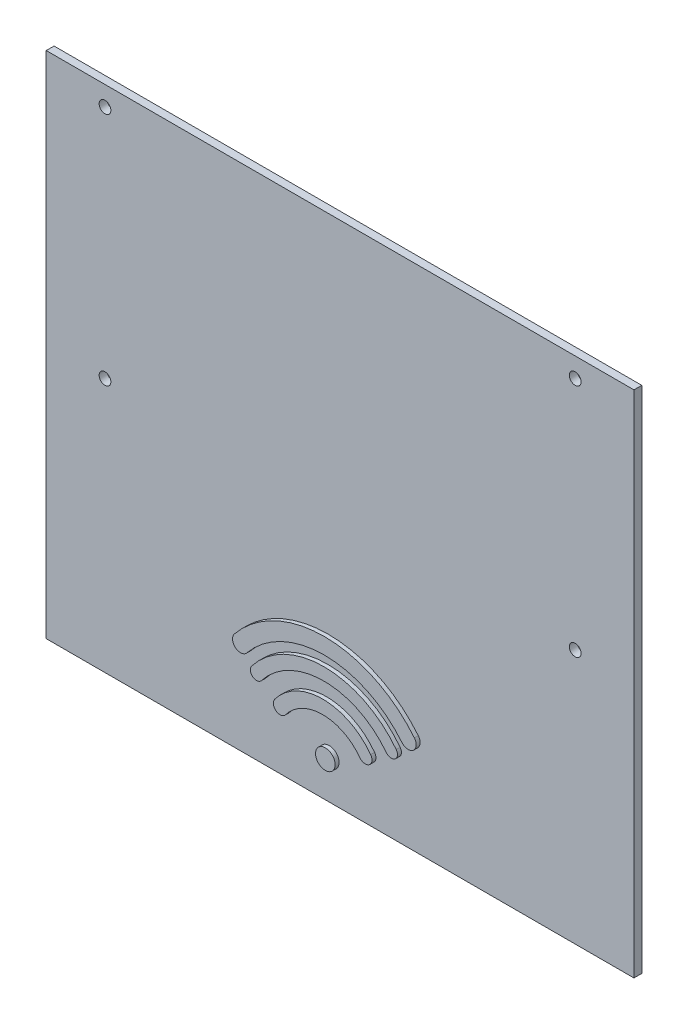
ISO-10303-21;
HEADER;
FILE_DESCRIPTION(('STEP AP214'),'2;1');
FILE_NAME('part.step','',(''),(''),'','','');
FILE_SCHEMA(('AUTOMOTIVE_DESIGN { 1 0 10303 214 1 1 1 1 }'));
ENDSEC;
DATA;
#1=APPLICATION_CONTEXT('core data for automotive mechanical design processes');
#2=APPLICATION_PROTOCOL_DEFINITION('international standard','automotive_design',2000,#1);
#3=PRODUCT_CONTEXT('',#1,'mechanical');
#4=PRODUCT('Part','Part','',(#3));
#5=PRODUCT_RELATED_PRODUCT_CATEGORY('part','',(#4));
#6=PRODUCT_DEFINITION_FORMATION('','',#4);
#7=PRODUCT_DEFINITION_CONTEXT('part definition',#1,'design');
#8=PRODUCT_DEFINITION('design','',#6,#7);
#9=PRODUCT_DEFINITION_SHAPE('','',#8);
#10=(LENGTH_UNIT() NAMED_UNIT(*) SI_UNIT(.MILLI.,.METRE.));
#11=(NAMED_UNIT(*) PLANE_ANGLE_UNIT() SI_UNIT($,.RADIAN.));
#12=(NAMED_UNIT(*) SI_UNIT($,.STERADIAN.) SOLID_ANGLE_UNIT());
#13=UNCERTAINTY_MEASURE_WITH_UNIT(LENGTH_MEASURE(1.E-05),#10,'distance_accuracy_value','');
#14=(GEOMETRIC_REPRESENTATION_CONTEXT(3) GLOBAL_UNCERTAINTY_ASSIGNED_CONTEXT((#13)) GLOBAL_UNIT_ASSIGNED_CONTEXT((#10,
#11,#12)) REPRESENTATION_CONTEXT('',''));
#15=CARTESIAN_POINT('',(0.,0.,0.));
#16=DIRECTION('',(0.,0.,1.));
#17=DIRECTION('',(1.,0.,0.));
#18=AXIS2_PLACEMENT_3D('',#15,#16,#17);
#19=CARTESIAN_POINT('',(0.,0.,2.));
#20=DIRECTION('',(0.,0.,1.));
#21=DIRECTION('',(1.,0.,0.));
#22=AXIS2_PLACEMENT_3D('',#19,#20,#21);
#23=PLANE('',#22);
#24=CARTESIAN_POINT('',(-4.64809572967323,-79.0103397341211,2.));
#25=DIRECTION('',(0.,0.,1.));
#26=DIRECTION('',(1.,0.,0.));
#27=AXIS2_PLACEMENT_3D('',#24,#25,#26);
#28=CIRCLE('',#27,2.5);
#29=CARTESIAN_POINT('',(-2.14809572967323,-79.0103397341211,2.));
#30=VERTEX_POINT('',#29);
#31=EDGE_CURVE('E233',#30,#30,#28,.T.);
#32=ORIENTED_EDGE('',*,*,#31,.F.);
#33=EDGE_LOOP('',(#32));
#34=FACE_BOUND('',#33,.T.);
#35=CARTESIAN_POINT('',(-61.8867474150665,-24.0103397341211,2.));
#36=DIRECTION('',(0.,0.,1.));
#37=DIRECTION('',(1.,0.,0.));
#38=AXIS2_PLACEMENT_3D('',#35,#36,#37);
#39=CIRCLE('',#38,1.5);
#40=CARTESIAN_POINT('',(-60.3867474150665,-24.0103397341211,2.));
#41=VERTEX_POINT('',#40);
#42=EDGE_CURVE('E246',#41,#41,#39,.T.);
#43=ORIENTED_EDGE('',*,*,#42,.F.);
#44=EDGE_LOOP('',(#43));
#45=FACE_BOUND('',#44,.T.);
#46=CARTESIAN_POINT('',(-61.8867474150665,35.9896602658789,2.));
#47=DIRECTION('',(0.,0.,1.));
#48=DIRECTION('',(1.,0.,0.));
#49=AXIS2_PLACEMENT_3D('',#46,#47,#48);
#50=CIRCLE('',#49,1.5);
#51=CARTESIAN_POINT('',(-60.3867474150665,35.9896602658789,2.));
#52=VERTEX_POINT('',#51);
#53=EDGE_CURVE('E258',#52,#52,#50,.T.);
#54=ORIENTED_EDGE('',*,*,#53,.F.);
#55=EDGE_LOOP('',(#54));
#56=FACE_BOUND('',#55,.T.);
#57=DIRECTION('',(0.,-1.,0.));
#58=VECTOR('',#57,1.);
#59=CARTESIAN_POINT('',(-76.8867474150665,40.9896602658789,2.));
#60=LINE('',#59,#58);
#61=CARTESIAN_POINT('',(-76.8867474150665,40.9896602658789,2.));
#62=VERTEX_POINT('',#61);
#63=CARTESIAN_POINT('',(-76.8867474150665,-89.0103397341211,2.));
#64=VERTEX_POINT('',#63);
#65=EDGE_CURVE('E264',#62,#64,#60,.T.);
#66=ORIENTED_EDGE('',*,*,#65,.T.);
#67=DIRECTION('',(1.,0.,0.));
#68=VECTOR('',#67,1.);
#69=CARTESIAN_POINT('',(-76.8867474150665,-89.0103397341211,2.));
#70=LINE('',#69,#68);
#71=CARTESIAN_POINT('',(73.1132525849335,-89.0103397341211,2.));
#72=VERTEX_POINT('',#71);
#73=EDGE_CURVE('E267',#64,#72,#70,.T.);
#74=ORIENTED_EDGE('',*,*,#73,.T.);
#75=DIRECTION('',(0.,1.,0.));
#76=VECTOR('',#75,1.);
#77=CARTESIAN_POINT('',(73.1132525849335,40.9896602658789,2.));
#78=LINE('',#77,#76);
#79=CARTESIAN_POINT('',(73.1132525849335,40.9896602658789,2.));
#80=VERTEX_POINT('',#79);
#81=EDGE_CURVE('E270',#72,#80,#78,.T.);
#82=ORIENTED_EDGE('',*,*,#81,.T.);
#83=DIRECTION('',(-1.,0.,0.));
#84=VECTOR('',#83,1.);
#85=CARTESIAN_POINT('',(-76.8867474150665,40.9896602658789,2.));
#86=LINE('',#85,#84);
#87=EDGE_CURVE('E272',#80,#62,#86,.T.);
#88=ORIENTED_EDGE('',*,*,#87,.T.);
#89=EDGE_LOOP('',(#66,#74,#82,#88));
#90=FACE_BOUND('',#89,.T.);
#91=CARTESIAN_POINT('',(58.1132525849335,35.9896602658789,2.));
#92=DIRECTION('',(0.,0.,1.));
#93=DIRECTION('',(1.,0.,0.));
#94=AXIS2_PLACEMENT_3D('',#91,#92,#93);
#95=CIRCLE('',#94,1.5);
#96=CARTESIAN_POINT('',(59.6132525849335,35.9896602658789,2.));
#97=VERTEX_POINT('',#96);
#98=EDGE_CURVE('E252',#97,#97,#95,.T.);
#99=ORIENTED_EDGE('',*,*,#98,.F.);
#100=EDGE_LOOP('',(#99));
#101=FACE_BOUND('',#100,.T.);
#102=CARTESIAN_POINT('',(58.1132525849335,-24.0103397341211,2.));
#103=DIRECTION('',(0.,0.,1.));
#104=DIRECTION('',(1.,0.,0.));
#105=AXIS2_PLACEMENT_3D('',#102,#103,#104);
#106=CIRCLE('',#105,1.5);
#107=CARTESIAN_POINT('',(59.6132525849335,-24.0103397341211,2.));
#108=VERTEX_POINT('',#107);
#109=EDGE_CURVE('E240',#108,#108,#106,.T.);
#110=ORIENTED_EDGE('',*,*,#109,.F.);
#111=EDGE_LOOP('',(#110));
#112=FACE_BOUND('',#111,.T.);
#113=CARTESIAN_POINT('',(-5.32355895711767,-81.302705542707,2.));
#114=DIRECTION('',(0.,0.,1.));
#115=DIRECTION('',(1.,0.,0.));
#116=AXIS2_PLACEMENT_3D('',#113,#114,#115);
#117=CIRCLE('',#116,15.2395534537991);
#118=CARTESIAN_POINT('',(6.92323534215543,-72.2329746281489,2.));
#119=VERTEX_POINT('',#118);
#120=CARTESIAN_POINT('',(-17.5703532563908,-72.2329746281489,2.));
#121=VERTEX_POINT('',#120);
#122=EDGE_CURVE('E218',#119,#121,#117,.T.);
#123=ORIENTED_EDGE('',*,*,#122,.F.);
#124=CARTESIAN_POINT('',(5.54142549136216,-73.2563153665922,2.));
#125=DIRECTION('',(0.,0.,1.));
#126=DIRECTION('',(1.,0.,0.));
#127=AXIS2_PLACEMENT_3D('',#124,#125,#126);
#128=CIRCLE('',#127,1.71948385590179);
#129=CARTESIAN_POINT('',(4.1596156405689,-74.2796561050354,2.));
#130=VERTEX_POINT('',#129);
#131=EDGE_CURVE('E204',#130,#119,#128,.T.);
#132=ORIENTED_EDGE('',*,*,#131,.F.);
#133=CARTESIAN_POINT('',(-5.32355895711767,-81.302705542707,2.));
#134=DIRECTION('',(0.,0.,-1.));
#135=DIRECTION('',(1.,0.,0.));
#136=AXIS2_PLACEMENT_3D('',#133,#134,#135);
#137=CIRCLE('',#136,11.8005857419955);
#138=CARTESIAN_POINT('',(-14.8067335548042,-74.2796561050354,2.));
#139=VERTEX_POINT('',#138);
#140=EDGE_CURVE('E209',#139,#130,#137,.T.);
#141=ORIENTED_EDGE('',*,*,#140,.F.);
#142=CARTESIAN_POINT('',(-16.1885434055975,-73.2563153665922,2.));
#143=DIRECTION('',(0.,0.,1.));
#144=DIRECTION('',(1.,0.,0.));
#145=AXIS2_PLACEMENT_3D('',#142,#143,#144);
#146=CIRCLE('',#145,1.71948385590179);
#147=EDGE_CURVE('E220',#121,#139,#146,.T.);
#148=ORIENTED_EDGE('',*,*,#147,.F.);
#149=EDGE_LOOP('',(#123,#132,#141,#148));
#150=FACE_BOUND('',#149,.T.);
#151=CARTESIAN_POINT('',(-4.90031856724826,-81.6455579537006,2.));
#152=DIRECTION('',(0.,0.,1.));
#153=DIRECTION('',(1.,0.,0.));
#154=AXIS2_PLACEMENT_3D('',#151,#152,#153);
#155=CIRCLE('',#154,29.6115661554169);
#156=CARTESIAN_POINT('',(18.0783973424086,-62.9687417014611,2.));
#157=VERTEX_POINT('',#156);
#158=CARTESIAN_POINT('',(-27.8790344769051,-62.9687417014611,2.));
#159=VERTEX_POINT('',#158);
#160=EDGE_CURVE('E176',#157,#159,#155,.T.);
#161=ORIENTED_EDGE('',*,*,#160,.F.);
#162=CARTESIAN_POINT('',(16.4865053202874,-64.2626118597178,2.));
#163=DIRECTION('',(0.,0.,1.));
#164=DIRECTION('',(1.,0.,0.));
#165=AXIS2_PLACEMENT_3D('',#162,#163,#164);
#166=CIRCLE('',#165,2.05139469544994);
#167=CARTESIAN_POINT('',(14.8946132981662,-65.5564820179745,2.));
#168=VERTEX_POINT('',#167);
#169=EDGE_CURVE('E173',#168,#157,#166,.T.);
#170=ORIENTED_EDGE('',*,*,#169,.F.);
#171=CARTESIAN_POINT('',(-4.90031856724826,-81.6455579537006,2.));
#172=DIRECTION('',(0.,0.,-1.));
#173=DIRECTION('',(1.,0.,0.));
#174=AXIS2_PLACEMENT_3D('',#171,#172,#173);
#175=CIRCLE('',#174,25.508776764517);
#176=CARTESIAN_POINT('',(-24.6952504326628,-65.5564820179745,2.));
#177=VERTEX_POINT('',#176);
#178=EDGE_CURVE('E185',#177,#168,#175,.T.);
#179=ORIENTED_EDGE('',*,*,#178,.F.);
#180=CARTESIAN_POINT('',(-26.2871424547839,-64.2626118597178,2.));
#181=DIRECTION('',(0.,0.,1.));
#182=DIRECTION('',(1.,0.,0.));
#183=AXIS2_PLACEMENT_3D('',#180,#181,#182);
#184=CIRCLE('',#183,2.05139469544994);
#185=EDGE_CURVE('E193',#159,#177,#184,.T.);
#186=ORIENTED_EDGE('',*,*,#185,.F.);
#187=EDGE_LOOP('',(#161,#170,#179,#186));
#188=FACE_BOUND('',#187,.T.);
#189=CARTESIAN_POINT('',(-5.00790134380225,-82.0049986601813,2.));
#190=DIRECTION('',(0.,0.,1.));
#191=DIRECTION('',(1.,0.,0.));
#192=AXIS2_PLACEMENT_3D('',#189,#190,#191);
#193=CIRCLE('',#192,23.2550698957289);
#194=CARTESIAN_POINT('',(13.4430372930683,-67.8501005936576,2.));
#195=VERTEX_POINT('',#194);
#196=CARTESIAN_POINT('',(-23.4588399806728,-67.8501005936576,2.));
#197=VERTEX_POINT('',#196);
#198=EDGE_CURVE('E577',#195,#197,#193,.T.);
#199=ORIENTED_EDGE('',*,*,#198,.F.);
#200=CARTESIAN_POINT('',(12.1808720630696,-68.8183884691611,2.));
#201=DIRECTION('',(0.,0.,1.));
#202=DIRECTION('',(1.,0.,0.));
#203=AXIS2_PLACEMENT_3D('',#200,#201,#202);
#204=CIRCLE('',#203,1.59079932036215);
#205=CARTESIAN_POINT('',(10.918706833071,-69.7866763446646,2.));
#206=VERTEX_POINT('',#205);
#207=EDGE_CURVE('E171',#206,#195,#204,.T.);
#208=ORIENTED_EDGE('',*,*,#207,.F.);
#209=CARTESIAN_POINT('',(-5.00790134380225,-82.0049986601813,2.));
#210=DIRECTION('',(0.,0.,-1.));
#211=DIRECTION('',(1.,0.,0.));
#212=AXIS2_PLACEMENT_3D('',#209,#210,#211);
#213=CIRCLE('',#212,20.0734712550046);
#214=CARTESIAN_POINT('',(-20.9345095206755,-69.7866763446646,2.));
#215=VERTEX_POINT('',#214);
#216=EDGE_CURVE('E167',#215,#206,#213,.T.);
#217=ORIENTED_EDGE('',*,*,#216,.F.);
#218=CARTESIAN_POINT('',(-22.1966747506741,-68.8183884691611,2.));
#219=DIRECTION('',(0.,0.,1.));
#220=DIRECTION('',(1.,0.,0.));
#221=AXIS2_PLACEMENT_3D('',#218,#219,#220);
#222=CIRCLE('',#221,1.59079932036215);
#223=EDGE_CURVE('E574',#197,#215,#222,.T.);
#224=ORIENTED_EDGE('',*,*,#223,.F.);
#225=EDGE_LOOP('',(#199,#208,#217,#224));
#226=FACE_BOUND('',#225,.T.);
#227=ADVANCED_FACE('F34',(#34,#45,#56,#90,#101,#112,#150,#188,#226),#23,.T.);
#228=CARTESIAN_POINT('',(0.,0.,0.));
#229=DIRECTION('',(0.,0.,1.));
#230=DIRECTION('',(1.,0.,0.));
#231=AXIS2_PLACEMENT_3D('',#228,#229,#230);
#232=PLANE('',#231);
#233=DIRECTION('',(0.,-1.,0.));
#234=VECTOR('',#233,1.);
#235=CARTESIAN_POINT('',(-76.8867474150665,40.9896602658789,0.));
#236=LINE('',#235,#234);
#237=CARTESIAN_POINT('',(-76.8867474150665,40.9896602658789,0.));
#238=VERTEX_POINT('',#237);
#239=CARTESIAN_POINT('',(-76.8867474150665,-89.0103397341211,0.));
#240=VERTEX_POINT('',#239);
#241=EDGE_CURVE('E261',#238,#240,#236,.T.);
#242=ORIENTED_EDGE('',*,*,#241,.F.);
#243=DIRECTION('',(-1.,0.,0.));
#244=VECTOR('',#243,1.);
#245=CARTESIAN_POINT('',(-76.8867474150665,40.9896602658789,0.));
#246=LINE('',#245,#244);
#247=CARTESIAN_POINT('',(73.1132525849335,40.9896602658789,0.));
#248=VERTEX_POINT('',#247);
#249=EDGE_CURVE('E268',#248,#238,#246,.T.);
#250=ORIENTED_EDGE('',*,*,#249,.F.);
#251=DIRECTION('',(0.,1.,0.));
#252=VECTOR('',#251,1.);
#253=CARTESIAN_POINT('',(73.1132525849335,40.9896602658789,0.));
#254=LINE('',#253,#252);
#255=CARTESIAN_POINT('',(73.1132525849335,-89.0103397341211,0.));
#256=VERTEX_POINT('',#255);
#257=EDGE_CURVE('E279',#256,#248,#254,.T.);
#258=ORIENTED_EDGE('',*,*,#257,.F.);
#259=DIRECTION('',(1.,0.,0.));
#260=VECTOR('',#259,1.);
#261=CARTESIAN_POINT('',(-76.8867474150665,-89.0103397341211,0.));
#262=LINE('',#261,#260);
#263=EDGE_CURVE('E277',#240,#256,#262,.T.);
#264=ORIENTED_EDGE('',*,*,#263,.F.);
#265=EDGE_LOOP('',(#242,#250,#258,#264));
#266=FACE_BOUND('',#265,.T.);
#267=CARTESIAN_POINT('',(-61.8867474150665,35.9896602658789,0.));
#268=DIRECTION('',(0.,0.,1.));
#269=DIRECTION('',(1.,0.,0.));
#270=AXIS2_PLACEMENT_3D('',#267,#268,#269);
#271=CIRCLE('',#270,1.5);
#272=CARTESIAN_POINT('',(-60.3867474150665,35.9896602658789,0.));
#273=VERTEX_POINT('',#272);
#274=EDGE_CURVE('E255',#273,#273,#271,.T.);
#275=ORIENTED_EDGE('',*,*,#274,.T.);
#276=EDGE_LOOP('',(#275));
#277=FACE_BOUND('',#276,.T.);
#278=CARTESIAN_POINT('',(58.1132525849335,35.9896602658789,0.));
#279=DIRECTION('',(0.,0.,1.));
#280=DIRECTION('',(1.,0.,0.));
#281=AXIS2_PLACEMENT_3D('',#278,#279,#280);
#282=CIRCLE('',#281,1.5);
#283=CARTESIAN_POINT('',(59.6132525849335,35.9896602658789,0.));
#284=VERTEX_POINT('',#283);
#285=EDGE_CURVE('E249',#284,#284,#282,.T.);
#286=ORIENTED_EDGE('',*,*,#285,.T.);
#287=EDGE_LOOP('',(#286));
#288=FACE_BOUND('',#287,.T.);
#289=CARTESIAN_POINT('',(-61.8867474150665,-24.0103397341211,0.));
#290=DIRECTION('',(0.,0.,1.));
#291=DIRECTION('',(1.,0.,0.));
#292=AXIS2_PLACEMENT_3D('',#289,#290,#291);
#293=CIRCLE('',#292,1.5);
#294=CARTESIAN_POINT('',(-60.3867474150665,-24.0103397341211,0.));
#295=VERTEX_POINT('',#294);
#296=EDGE_CURVE('E243',#295,#295,#293,.T.);
#297=ORIENTED_EDGE('',*,*,#296,.T.);
#298=EDGE_LOOP('',(#297));
#299=FACE_BOUND('',#298,.T.);
#300=CARTESIAN_POINT('',(58.1132525849335,-24.0103397341211,0.));
#301=DIRECTION('',(0.,0.,1.));
#302=DIRECTION('',(1.,0.,0.));
#303=AXIS2_PLACEMENT_3D('',#300,#301,#302);
#304=CIRCLE('',#303,1.5);
#305=CARTESIAN_POINT('',(59.6132525849335,-24.0103397341211,0.));
#306=VERTEX_POINT('',#305);
#307=EDGE_CURVE('E237',#306,#306,#304,.T.);
#308=ORIENTED_EDGE('',*,*,#307,.T.);
#309=EDGE_LOOP('',(#308));
#310=FACE_BOUND('',#309,.T.);
#311=ADVANCED_FACE('F297',(#266,#277,#288,#299,#310),#232,.F.);
#312=CARTESIAN_POINT('',(-76.8867474150665,40.9896602658789,2.));
#313=DIRECTION('',(1.,0.,0.));
#314=DIRECTION('',(0.,1.,0.));
#315=AXIS2_PLACEMENT_3D('',#312,#313,#314);
#316=PLANE('',#315);
#317=ORIENTED_EDGE('',*,*,#241,.T.);
#318=DIRECTION('',(0.,0.,-1.));
#319=VECTOR('',#318,1.);
#320=CARTESIAN_POINT('',(-76.8867474150665,-89.0103397341211,2.));
#321=LINE('',#320,#319);
#322=EDGE_CURVE('E11',#64,#240,#321,.T.);
#323=ORIENTED_EDGE('',*,*,#322,.F.);
#324=ORIENTED_EDGE('',*,*,#65,.F.);
#325=DIRECTION('',(0.,0.,-1.));
#326=VECTOR('',#325,1.);
#327=CARTESIAN_POINT('',(-76.8867474150665,40.9896602658789,2.));
#328=LINE('',#327,#326);
#329=EDGE_CURVE('E274',#62,#238,#328,.T.);
#330=ORIENTED_EDGE('',*,*,#329,.T.);
#331=EDGE_LOOP('',(#317,#323,#324,#330));
#332=FACE_BOUND('',#331,.T.);
#333=ADVANCED_FACE('F36',(#332),#316,.F.);
#334=CARTESIAN_POINT('',(-76.8867474150665,-89.0103397341211,2.));
#335=DIRECTION('',(0.,1.,0.));
#336=DIRECTION('',(0.,0.,1.));
#337=AXIS2_PLACEMENT_3D('',#334,#335,#336);
#338=PLANE('',#337);
#339=ORIENTED_EDGE('',*,*,#263,.T.);
#340=DIRECTION('',(0.,0.,-1.));
#341=VECTOR('',#340,1.);
#342=CARTESIAN_POINT('',(73.1132525849335,-89.0103397341211,2.));
#343=LINE('',#342,#341);
#344=EDGE_CURVE('E42',#72,#256,#343,.T.);
#345=ORIENTED_EDGE('',*,*,#344,.F.);
#346=ORIENTED_EDGE('',*,*,#73,.F.);
#347=ORIENTED_EDGE('',*,*,#322,.T.);
#348=EDGE_LOOP('',(#339,#345,#346,#347));
#349=FACE_BOUND('',#348,.T.);
#350=ADVANCED_FACE('F308',(#349),#338,.F.);
#351=CARTESIAN_POINT('',(73.1132525849335,40.9896602658789,2.));
#352=DIRECTION('',(-1.,0.,0.));
#353=DIRECTION('',(0.,-1.,0.));
#354=AXIS2_PLACEMENT_3D('',#351,#352,#353);
#355=PLANE('',#354);
#356=ORIENTED_EDGE('',*,*,#257,.T.);
#357=DIRECTION('',(0.,0.,-1.));
#358=VECTOR('',#357,1.);
#359=CARTESIAN_POINT('',(73.1132525849335,40.9896602658789,2.));
#360=LINE('',#359,#358);
#361=EDGE_CURVE('E284',#80,#248,#360,.T.);
#362=ORIENTED_EDGE('',*,*,#361,.F.);
#363=ORIENTED_EDGE('',*,*,#81,.F.);
#364=ORIENTED_EDGE('',*,*,#344,.T.);
#365=EDGE_LOOP('',(#356,#362,#363,#364));
#366=FACE_BOUND('',#365,.T.);
#367=ADVANCED_FACE('F291',(#366),#355,.F.);
#368=CARTESIAN_POINT('',(-76.8867474150665,40.9896602658789,2.));
#369=DIRECTION('',(0.,-1.,0.));
#370=DIRECTION('',(1.,0.,0.));
#371=AXIS2_PLACEMENT_3D('',#368,#369,#370);
#372=PLANE('',#371);
#373=ORIENTED_EDGE('',*,*,#249,.T.);
#374=ORIENTED_EDGE('',*,*,#329,.F.);
#375=ORIENTED_EDGE('',*,*,#87,.F.);
#376=ORIENTED_EDGE('',*,*,#361,.T.);
#377=EDGE_LOOP('',(#373,#374,#375,#376));
#378=FACE_BOUND('',#377,.T.);
#379=ADVANCED_FACE('F301',(#378),#372,.F.);
#380=CARTESIAN_POINT('',(-61.8867474150665,35.9896602658789,2.));
#381=DIRECTION('',(0.,0.,-1.));
#382=DIRECTION('',(-1.,0.,0.));
#383=AXIS2_PLACEMENT_3D('',#380,#381,#382);
#384=CYLINDRICAL_SURFACE('',#383,1.5);
#385=ORIENTED_EDGE('',*,*,#53,.T.);
#386=EDGE_LOOP('',(#385));
#387=FACE_BOUND('',#386,.T.);
#388=ORIENTED_EDGE('',*,*,#274,.F.);
#389=EDGE_LOOP('',(#388));
#390=FACE_BOUND('',#389,.T.);
#391=ADVANCED_FACE('F325',(#387,#390),#384,.F.);
#392=CARTESIAN_POINT('',(58.1132525849335,35.9896602658789,2.));
#393=DIRECTION('',(0.,0.,-1.));
#394=DIRECTION('',(-1.,0.,0.));
#395=AXIS2_PLACEMENT_3D('',#392,#393,#394);
#396=CYLINDRICAL_SURFACE('',#395,1.5);
#397=ORIENTED_EDGE('',*,*,#98,.T.);
#398=EDGE_LOOP('',(#397));
#399=FACE_BOUND('',#398,.T.);
#400=ORIENTED_EDGE('',*,*,#285,.F.);
#401=EDGE_LOOP('',(#400));
#402=FACE_BOUND('',#401,.T.);
#403=ADVANCED_FACE('F332',(#399,#402),#396,.F.);
#404=CARTESIAN_POINT('',(-61.8867474150665,-24.0103397341211,2.));
#405=DIRECTION('',(0.,0.,-1.));
#406=DIRECTION('',(-1.,0.,0.));
#407=AXIS2_PLACEMENT_3D('',#404,#405,#406);
#408=CYLINDRICAL_SURFACE('',#407,1.5);
#409=ORIENTED_EDGE('',*,*,#42,.T.);
#410=EDGE_LOOP('',(#409));
#411=FACE_BOUND('',#410,.T.);
#412=ORIENTED_EDGE('',*,*,#296,.F.);
#413=EDGE_LOOP('',(#412));
#414=FACE_BOUND('',#413,.T.);
#415=ADVANCED_FACE('F337',(#411,#414),#408,.F.);
#416=CARTESIAN_POINT('',(58.1132525849335,-24.0103397341211,2.));
#417=DIRECTION('',(0.,0.,-1.));
#418=DIRECTION('',(-1.,0.,0.));
#419=AXIS2_PLACEMENT_3D('',#416,#417,#418);
#420=CYLINDRICAL_SURFACE('',#419,1.5);
#421=ORIENTED_EDGE('',*,*,#109,.T.);
#422=EDGE_LOOP('',(#421));
#423=FACE_BOUND('',#422,.T.);
#424=ORIENTED_EDGE('',*,*,#307,.F.);
#425=EDGE_LOOP('',(#424));
#426=FACE_BOUND('',#425,.T.);
#427=ADVANCED_FACE('F349',(#423,#426),#420,.F.);
#428=CARTESIAN_POINT('',(-4.64809572967323,-79.0103397341211,3.));
#429=DIRECTION('',(0.,0.,-1.));
#430=DIRECTION('',(-1.,0.,0.));
#431=AXIS2_PLACEMENT_3D('',#428,#429,#430);
#432=CYLINDRICAL_SURFACE('',#431,2.5);
#433=CARTESIAN_POINT('',(-4.64809572967323,-79.0103397341211,3.));
#434=DIRECTION('',(0.,0.,1.));
#435=DIRECTION('',(1.,0.,0.));
#436=AXIS2_PLACEMENT_3D('',#433,#434,#435);
#437=CIRCLE('',#436,2.5);
#438=CARTESIAN_POINT('',(-2.14809572967323,-79.0103397341211,3.));
#439=VERTEX_POINT('',#438);
#440=EDGE_CURVE('E234',#439,#439,#437,.T.);
#441=ORIENTED_EDGE('',*,*,#440,.F.);
#442=EDGE_LOOP('',(#441));
#443=FACE_BOUND('',#442,.T.);
#444=ORIENTED_EDGE('',*,*,#31,.T.);
#445=EDGE_LOOP('',(#444));
#446=FACE_BOUND('',#445,.T.);
#447=ADVANCED_FACE('F351',(#443,#446),#432,.T.);
#448=CARTESIAN_POINT('',(-4.64809572967323,-79.0103397341211,3.));
#449=DIRECTION('',(0.,0.,1.));
#450=DIRECTION('',(1.,0.,0.));
#451=AXIS2_PLACEMENT_3D('',#448,#449,#450);
#452=PLANE('',#451);
#453=ORIENTED_EDGE('',*,*,#440,.T.);
#454=EDGE_LOOP('',(#453));
#455=FACE_BOUND('',#454,.T.);
#456=ADVANCED_FACE('F358',(#455),#452,.T.);
#457=CARTESIAN_POINT('',(5.54142549136216,-73.2563153665922,3.));
#458=DIRECTION('',(0.,0.,-1.));
#459=DIRECTION('',(-1.,0.,0.));
#460=AXIS2_PLACEMENT_3D('',#457,#458,#459);
#461=CYLINDRICAL_SURFACE('',#460,1.71948385590179);
#462=ORIENTED_EDGE('',*,*,#131,.T.);
#463=DIRECTION('',(0.,0.,-1.));
#464=VECTOR('',#463,1.);
#465=CARTESIAN_POINT('',(6.92323534215543,-72.2329746281489,3.));
#466=LINE('',#465,#464);
#467=CARTESIAN_POINT('',(6.92323534215543,-72.2329746281489,3.));
#468=VERTEX_POINT('',#467);
#469=EDGE_CURVE('E231',#468,#119,#466,.T.);
#470=ORIENTED_EDGE('',*,*,#469,.F.);
#471=CARTESIAN_POINT('',(5.54142549136216,-73.2563153665922,3.));
#472=DIRECTION('',(0.,0.,1.));
#473=DIRECTION('',(1.,0.,0.));
#474=AXIS2_PLACEMENT_3D('',#471,#472,#473);
#475=CIRCLE('',#474,1.71948385590179);
#476=CARTESIAN_POINT('',(4.1596156405689,-74.2796561050354,3.));
#477=VERTEX_POINT('',#476);
#478=EDGE_CURVE('E205',#477,#468,#475,.T.);
#479=ORIENTED_EDGE('',*,*,#478,.F.);
#480=DIRECTION('',(0.,0.,-1.));
#481=VECTOR('',#480,1.);
#482=CARTESIAN_POINT('',(4.1596156405689,-74.2796561050354,3.));
#483=LINE('',#482,#481);
#484=EDGE_CURVE('E215',#477,#130,#483,.T.);
#485=ORIENTED_EDGE('',*,*,#484,.T.);
#486=EDGE_LOOP('',(#462,#470,#479,#485));
#487=FACE_BOUND('',#486,.T.);
#488=ADVANCED_FACE('F366',(#487),#461,.T.);
#489=CARTESIAN_POINT('',(-5.32355895711767,-81.302705542707,3.));
#490=DIRECTION('',(0.,0.,-1.));
#491=DIRECTION('',(-1.,0.,0.));
#492=AXIS2_PLACEMENT_3D('',#489,#490,#491);
#493=CYLINDRICAL_SURFACE('',#492,15.2395534537991);
#494=ORIENTED_EDGE('',*,*,#122,.T.);
#495=DIRECTION('',(0.,0.,-1.));
#496=VECTOR('',#495,1.);
#497=CARTESIAN_POINT('',(-17.5703532563908,-72.2329746281489,3.));
#498=LINE('',#497,#496);
#499=CARTESIAN_POINT('',(-17.5703532563908,-72.2329746281489,3.));
#500=VERTEX_POINT('',#499);
#501=EDGE_CURVE('E228',#500,#121,#498,.T.);
#502=ORIENTED_EDGE('',*,*,#501,.F.);
#503=CARTESIAN_POINT('',(-5.32355895711767,-81.302705542707,3.));
#504=DIRECTION('',(0.,0.,1.));
#505=DIRECTION('',(1.,0.,0.));
#506=AXIS2_PLACEMENT_3D('',#503,#504,#505);
#507=CIRCLE('',#506,15.2395534537991);
#508=EDGE_CURVE('E208',#468,#500,#507,.T.);
#509=ORIENTED_EDGE('',*,*,#508,.F.);
#510=ORIENTED_EDGE('',*,*,#469,.T.);
#511=EDGE_LOOP('',(#494,#502,#509,#510));
#512=FACE_BOUND('',#511,.T.);
#513=ADVANCED_FACE('F370',(#512),#493,.T.);
#514=CARTESIAN_POINT('',(-16.1885434055975,-73.2563153665922,3.));
#515=DIRECTION('',(0.,0.,-1.));
#516=DIRECTION('',(-1.,0.,0.));
#517=AXIS2_PLACEMENT_3D('',#514,#515,#516);
#518=CYLINDRICAL_SURFACE('',#517,1.71948385590179);
#519=ORIENTED_EDGE('',*,*,#147,.T.);
#520=DIRECTION('',(0.,0.,-1.));
#521=VECTOR('',#520,1.);
#522=CARTESIAN_POINT('',(-14.8067335548042,-74.2796561050354,3.));
#523=LINE('',#522,#521);
#524=CARTESIAN_POINT('',(-14.8067335548042,-74.2796561050354,3.));
#525=VERTEX_POINT('',#524);
#526=EDGE_CURVE('E226',#525,#139,#523,.T.);
#527=ORIENTED_EDGE('',*,*,#526,.F.);
#528=CARTESIAN_POINT('',(-16.1885434055975,-73.2563153665922,3.));
#529=DIRECTION('',(0.,0.,1.));
#530=DIRECTION('',(1.,0.,0.));
#531=AXIS2_PLACEMENT_3D('',#528,#529,#530);
#532=CIRCLE('',#531,1.71948385590179);
#533=EDGE_CURVE('E211',#500,#525,#532,.T.);
#534=ORIENTED_EDGE('',*,*,#533,.F.);
#535=ORIENTED_EDGE('',*,*,#501,.T.);
#536=EDGE_LOOP('',(#519,#527,#534,#535));
#537=FACE_BOUND('',#536,.T.);
#538=ADVANCED_FACE('F374',(#537),#518,.T.);
#539=CARTESIAN_POINT('',(-5.32355895711767,-81.302705542707,3.));
#540=DIRECTION('',(0.,0.,-1.));
#541=DIRECTION('',(-1.,0.,0.));
#542=AXIS2_PLACEMENT_3D('',#539,#540,#541);
#543=CYLINDRICAL_SURFACE('',#542,11.8005857419955);
#544=ORIENTED_EDGE('',*,*,#140,.T.);
#545=ORIENTED_EDGE('',*,*,#484,.F.);
#546=CARTESIAN_POINT('',(-5.32355895711767,-81.302705542707,3.));
#547=DIRECTION('',(0.,0.,-1.));
#548=DIRECTION('',(1.,0.,0.));
#549=AXIS2_PLACEMENT_3D('',#546,#547,#548);
#550=CIRCLE('',#549,11.8005857419955);
#551=EDGE_CURVE('E213',#525,#477,#550,.T.);
#552=ORIENTED_EDGE('',*,*,#551,.F.);
#553=ORIENTED_EDGE('',*,*,#526,.T.);
#554=EDGE_LOOP('',(#544,#545,#552,#553));
#555=FACE_BOUND('',#554,.T.);
#556=ADVANCED_FACE('F378',(#555),#543,.F.);
#557=CARTESIAN_POINT('',(0.108933267122246,-77.2795104546496,3.));
#558=DIRECTION('',(0.,0.,1.));
#559=DIRECTION('',(1.,0.,0.));
#560=AXIS2_PLACEMENT_3D('',#557,#558,#559);
#561=PLANE('',#560);
#562=ORIENTED_EDGE('',*,*,#478,.T.);
#563=ORIENTED_EDGE('',*,*,#508,.T.);
#564=ORIENTED_EDGE('',*,*,#533,.T.);
#565=ORIENTED_EDGE('',*,*,#551,.T.);
#566=EDGE_LOOP('',(#562,#563,#564,#565));
#567=FACE_BOUND('',#566,.T.);
#568=ADVANCED_FACE('F382',(#567),#561,.T.);
#569=CARTESIAN_POINT('',(16.4865053202874,-64.2626118597178,3.));
#570=DIRECTION('',(0.,0.,-1.));
#571=DIRECTION('',(-1.,0.,0.));
#572=AXIS2_PLACEMENT_3D('',#569,#570,#571);
#573=CYLINDRICAL_SURFACE('',#572,2.05139469544994);
#574=ORIENTED_EDGE('',*,*,#169,.T.);
#575=DIRECTION('',(0.,0.,-1.));
#576=VECTOR('',#575,1.);
#577=CARTESIAN_POINT('',(18.0783973424086,-62.9687417014611,3.));
#578=LINE('',#577,#576);
#579=CARTESIAN_POINT('',(18.0783973424086,-62.9687417014611,3.));
#580=VERTEX_POINT('',#579);
#581=EDGE_CURVE('E202',#580,#157,#578,.T.);
#582=ORIENTED_EDGE('',*,*,#581,.F.);
#583=CARTESIAN_POINT('',(16.4865053202874,-64.2626118597178,3.));
#584=DIRECTION('',(0.,0.,1.));
#585=DIRECTION('',(1.,0.,0.));
#586=AXIS2_PLACEMENT_3D('',#583,#584,#585);
#587=CIRCLE('',#586,2.05139469544994);
#588=CARTESIAN_POINT('',(14.8946132981662,-65.5564820179745,3.));
#589=VERTEX_POINT('',#588);
#590=EDGE_CURVE('E181',#589,#580,#587,.T.);
#591=ORIENTED_EDGE('',*,*,#590,.F.);
#592=DIRECTION('',(0.,0.,-1.));
#593=VECTOR('',#592,1.);
#594=CARTESIAN_POINT('',(14.8946132981662,-65.5564820179745,3.));
#595=LINE('',#594,#593);
#596=EDGE_CURVE('E190',#589,#168,#595,.T.);
#597=ORIENTED_EDGE('',*,*,#596,.T.);
#598=EDGE_LOOP('',(#574,#582,#591,#597));
#599=FACE_BOUND('',#598,.T.);
#600=ADVANCED_FACE('F386',(#599),#573,.T.);
#601=CARTESIAN_POINT('',(-4.90031856724826,-81.6455579537006,3.));
#602=DIRECTION('',(0.,0.,-1.));
#603=DIRECTION('',(-1.,0.,0.));
#604=AXIS2_PLACEMENT_3D('',#601,#602,#603);
#605=CYLINDRICAL_SURFACE('',#604,29.6115661554169);
#606=ORIENTED_EDGE('',*,*,#160,.T.);
#607=DIRECTION('',(0.,0.,-1.));
#608=VECTOR('',#607,1.);
#609=CARTESIAN_POINT('',(-27.8790344769051,-62.9687417014611,3.));
#610=LINE('',#609,#608);
#611=CARTESIAN_POINT('',(-27.8790344769051,-62.9687417014611,3.));
#612=VERTEX_POINT('',#611);
#613=EDGE_CURVE('E199',#612,#159,#610,.T.);
#614=ORIENTED_EDGE('',*,*,#613,.F.);
#615=CARTESIAN_POINT('',(-4.90031856724826,-81.6455579537006,3.));
#616=DIRECTION('',(0.,0.,1.));
#617=DIRECTION('',(1.,0.,0.));
#618=AXIS2_PLACEMENT_3D('',#615,#616,#617);
#619=CIRCLE('',#618,29.6115661554169);
#620=EDGE_CURVE('E184',#580,#612,#619,.T.);
#621=ORIENTED_EDGE('',*,*,#620,.F.);
#622=ORIENTED_EDGE('',*,*,#581,.T.);
#623=EDGE_LOOP('',(#606,#614,#621,#622));
#624=FACE_BOUND('',#623,.T.);
#625=ADVANCED_FACE('F390',(#624),#605,.T.);
#626=CARTESIAN_POINT('',(-26.2871424547839,-64.2626118597178,3.));
#627=DIRECTION('',(0.,0.,-1.));
#628=DIRECTION('',(-1.,0.,0.));
#629=AXIS2_PLACEMENT_3D('',#626,#627,#628);
#630=CYLINDRICAL_SURFACE('',#629,2.05139469544994);
#631=ORIENTED_EDGE('',*,*,#185,.T.);
#632=DIRECTION('',(0.,0.,-1.));
#633=VECTOR('',#632,1.);
#634=CARTESIAN_POINT('',(-24.6952504326628,-65.5564820179745,3.));
#635=LINE('',#634,#633);
#636=CARTESIAN_POINT('',(-24.6952504326628,-65.5564820179745,3.));
#637=VERTEX_POINT('',#636);
#638=EDGE_CURVE('E57',#637,#177,#635,.T.);
#639=ORIENTED_EDGE('',*,*,#638,.F.);
#640=CARTESIAN_POINT('',(-26.2871424547839,-64.2626118597178,3.));
#641=DIRECTION('',(0.,0.,1.));
#642=DIRECTION('',(1.,0.,0.));
#643=AXIS2_PLACEMENT_3D('',#640,#641,#642);
#644=CIRCLE('',#643,2.05139469544994);
#645=EDGE_CURVE('E187',#612,#637,#644,.T.);
#646=ORIENTED_EDGE('',*,*,#645,.F.);
#647=ORIENTED_EDGE('',*,*,#613,.T.);
#648=EDGE_LOOP('',(#631,#639,#646,#647));
#649=FACE_BOUND('',#648,.T.);
#650=ADVANCED_FACE('F394',(#649),#630,.T.);
#651=CARTESIAN_POINT('',(-4.90031856724826,-81.6455579537006,3.));
#652=DIRECTION('',(0.,0.,-1.));
#653=DIRECTION('',(-1.,0.,0.));
#654=AXIS2_PLACEMENT_3D('',#651,#652,#653);
#655=CYLINDRICAL_SURFACE('',#654,25.508776764517);
#656=ORIENTED_EDGE('',*,*,#178,.T.);
#657=ORIENTED_EDGE('',*,*,#596,.F.);
#658=CARTESIAN_POINT('',(-4.90031856724826,-81.6455579537006,3.));
#659=DIRECTION('',(0.,0.,-1.));
#660=DIRECTION('',(1.,0.,0.));
#661=AXIS2_PLACEMENT_3D('',#658,#659,#660);
#662=CIRCLE('',#661,25.508776764517);
#663=EDGE_CURVE('E189',#637,#589,#662,.T.);
#664=ORIENTED_EDGE('',*,*,#663,.F.);
#665=ORIENTED_EDGE('',*,*,#638,.T.);
#666=EDGE_LOOP('',(#656,#657,#664,#665));
#667=FACE_BOUND('',#666,.T.);
#668=ADVANCED_FACE('F398',(#667),#655,.F.);
#669=CARTESIAN_POINT('',(5.79309337651957,-72.9540849067092,3.));
#670=DIRECTION('',(0.,0.,1.));
#671=DIRECTION('',(1.,0.,0.));
#672=AXIS2_PLACEMENT_3D('',#669,#670,#671);
#673=PLANE('',#672);
#674=ORIENTED_EDGE('',*,*,#590,.T.);
#675=ORIENTED_EDGE('',*,*,#620,.T.);
#676=ORIENTED_EDGE('',*,*,#645,.T.);
#677=ORIENTED_EDGE('',*,*,#663,.T.);
#678=EDGE_LOOP('',(#674,#675,#676,#677));
#679=FACE_BOUND('',#678,.T.);
#680=ADVANCED_FACE('F402',(#679),#673,.T.);
#681=CARTESIAN_POINT('',(12.1808720630696,-68.8183884691611,3.));
#682=DIRECTION('',(0.,0.,-1.));
#683=DIRECTION('',(-1.,0.,0.));
#684=AXIS2_PLACEMENT_3D('',#681,#682,#683);
#685=CYLINDRICAL_SURFACE('',#684,1.59079932036215);
#686=ORIENTED_EDGE('',*,*,#207,.T.);
#687=DIRECTION('',(0.,0.,-1.));
#688=VECTOR('',#687,1.);
#689=CARTESIAN_POINT('',(13.4430372930683,-67.8501005936576,3.));
#690=LINE('',#689,#688);
#691=CARTESIAN_POINT('',(13.4430372930683,-67.8501005936576,3.));
#692=VERTEX_POINT('',#691);
#693=EDGE_CURVE('E152',#692,#195,#690,.T.);
#694=ORIENTED_EDGE('',*,*,#693,.F.);
#695=CARTESIAN_POINT('',(12.1808720630696,-68.8183884691611,3.));
#696=DIRECTION('',(0.,0.,1.));
#697=DIRECTION('',(1.,0.,0.));
#698=AXIS2_PLACEMENT_3D('',#695,#696,#697);
#699=CIRCLE('',#698,1.59079932036215);
#700=CARTESIAN_POINT('',(10.918706833071,-69.7866763446646,3.));
#701=VERTEX_POINT('',#700);
#702=EDGE_CURVE('E159',#701,#692,#699,.T.);
#703=ORIENTED_EDGE('',*,*,#702,.F.);
#704=DIRECTION('',(0.,0.,-1.));
#705=VECTOR('',#704,1.);
#706=CARTESIAN_POINT('',(10.918706833071,-69.7866763446646,3.));
#707=LINE('',#706,#705);
#708=EDGE_CURVE('E571',#701,#206,#707,.T.);
#709=ORIENTED_EDGE('',*,*,#708,.T.);
#710=EDGE_LOOP('',(#686,#694,#703,#709));
#711=FACE_BOUND('',#710,.T.);
#712=ADVANCED_FACE('F169',(#711),#685,.T.);
#713=CARTESIAN_POINT('',(-5.00790134380225,-82.0049986601813,3.));
#714=DIRECTION('',(0.,0.,-1.));
#715=DIRECTION('',(-1.,0.,0.));
#716=AXIS2_PLACEMENT_3D('',#713,#714,#715);
#717=CYLINDRICAL_SURFACE('',#716,23.2550698957289);
#718=ORIENTED_EDGE('',*,*,#198,.T.);
#719=DIRECTION('',(0.,0.,-1.));
#720=VECTOR('',#719,1.);
#721=CARTESIAN_POINT('',(-23.4588399806728,-67.8501005936576,3.));
#722=LINE('',#721,#720);
#723=CARTESIAN_POINT('',(-23.4588399806728,-67.8501005936576,3.));
#724=VERTEX_POINT('',#723);
#725=EDGE_CURVE('E155',#724,#197,#722,.T.);
#726=ORIENTED_EDGE('',*,*,#725,.F.);
#727=CARTESIAN_POINT('',(-5.00790134380225,-82.0049986601813,3.));
#728=DIRECTION('',(0.,0.,1.));
#729=DIRECTION('',(1.,0.,0.));
#730=AXIS2_PLACEMENT_3D('',#727,#728,#729);
#731=CIRCLE('',#730,23.2550698957289);
#732=EDGE_CURVE('E148',#692,#724,#731,.T.);
#733=ORIENTED_EDGE('',*,*,#732,.F.);
#734=ORIENTED_EDGE('',*,*,#693,.T.);
#735=EDGE_LOOP('',(#718,#726,#733,#734));
#736=FACE_BOUND('',#735,.T.);
#737=ADVANCED_FACE('F150',(#736),#717,.T.);
#738=CARTESIAN_POINT('',(-22.1966747506741,-68.8183884691611,3.));
#739=DIRECTION('',(0.,0.,-1.));
#740=DIRECTION('',(-1.,0.,0.));
#741=AXIS2_PLACEMENT_3D('',#738,#739,#740);
#742=CYLINDRICAL_SURFACE('',#741,1.59079932036215);
#743=ORIENTED_EDGE('',*,*,#223,.T.);
#744=DIRECTION('',(0.,0.,-1.));
#745=VECTOR('',#744,1.);
#746=CARTESIAN_POINT('',(-20.9345095206755,-69.7866763446646,3.));
#747=LINE('',#746,#745);
#748=CARTESIAN_POINT('',(-20.9345095206755,-69.7866763446646,3.));
#749=VERTEX_POINT('',#748);
#750=EDGE_CURVE('E49',#749,#215,#747,.T.);
#751=ORIENTED_EDGE('',*,*,#750,.F.);
#752=CARTESIAN_POINT('',(-22.1966747506741,-68.8183884691611,3.));
#753=DIRECTION('',(0.,0.,1.));
#754=DIRECTION('',(1.,0.,0.));
#755=AXIS2_PLACEMENT_3D('',#752,#753,#754);
#756=CIRCLE('',#755,1.59079932036215);
#757=EDGE_CURVE('E158',#724,#749,#756,.T.);
#758=ORIENTED_EDGE('',*,*,#757,.F.);
#759=ORIENTED_EDGE('',*,*,#725,.T.);
#760=EDGE_LOOP('',(#743,#751,#758,#759));
#761=FACE_BOUND('',#760,.T.);
#762=ADVANCED_FACE('F410',(#761),#742,.T.);
#763=CARTESIAN_POINT('',(-5.00790134380225,-82.0049986601813,3.));
#764=DIRECTION('',(0.,0.,-1.));
#765=DIRECTION('',(-1.,0.,0.));
#766=AXIS2_PLACEMENT_3D('',#763,#764,#765);
#767=CYLINDRICAL_SURFACE('',#766,20.0734712550046);
#768=ORIENTED_EDGE('',*,*,#216,.T.);
#769=ORIENTED_EDGE('',*,*,#708,.F.);
#770=CARTESIAN_POINT('',(-5.00790134380225,-82.0049986601813,3.));
#771=DIRECTION('',(0.,0.,-1.));
#772=DIRECTION('',(1.,0.,0.));
#773=AXIS2_PLACEMENT_3D('',#770,#771,#772);
#774=CIRCLE('',#773,20.0734712550046);
#775=EDGE_CURVE('E163',#749,#701,#774,.T.);
#776=ORIENTED_EDGE('',*,*,#775,.F.);
#777=ORIENTED_EDGE('',*,*,#750,.T.);
#778=EDGE_LOOP('',(#768,#769,#776,#777));
#779=FACE_BOUND('',#778,.T.);
#780=ADVANCED_FACE('F413',(#779),#767,.F.);
#781=CARTESIAN_POINT('',(3.58648535963368,-75.4116935646712,3.));
#782=DIRECTION('',(0.,0.,1.));
#783=DIRECTION('',(1.,0.,0.));
#784=AXIS2_PLACEMENT_3D('',#781,#782,#783);
#785=PLANE('',#784);
#786=ORIENTED_EDGE('',*,*,#702,.T.);
#787=ORIENTED_EDGE('',*,*,#732,.T.);
#788=ORIENTED_EDGE('',*,*,#757,.T.);
#789=ORIENTED_EDGE('',*,*,#775,.T.);
#790=EDGE_LOOP('',(#786,#787,#788,#789));
#791=FACE_BOUND('',#790,.T.);
#792=ADVANCED_FACE('F162',(#791),#785,.T.);
#793=CLOSED_SHELL('',(#227,#311,#333,#350,#367,#379,#391,#403,#415,#427,#447,#456,#488,#513,
#538,#556,#568,#600,#625,#650,#668,#680,#712,#737,#762,#780,#792));
#794=MANIFOLD_SOLID_BREP('B2',#793);
#795=ADVANCED_BREP_SHAPE_REPRESENTATION('',(#18,#794),#14);
#796=SHAPE_DEFINITION_REPRESENTATION(#9,#795);
ENDSEC;
END-ISO-10303-21;
